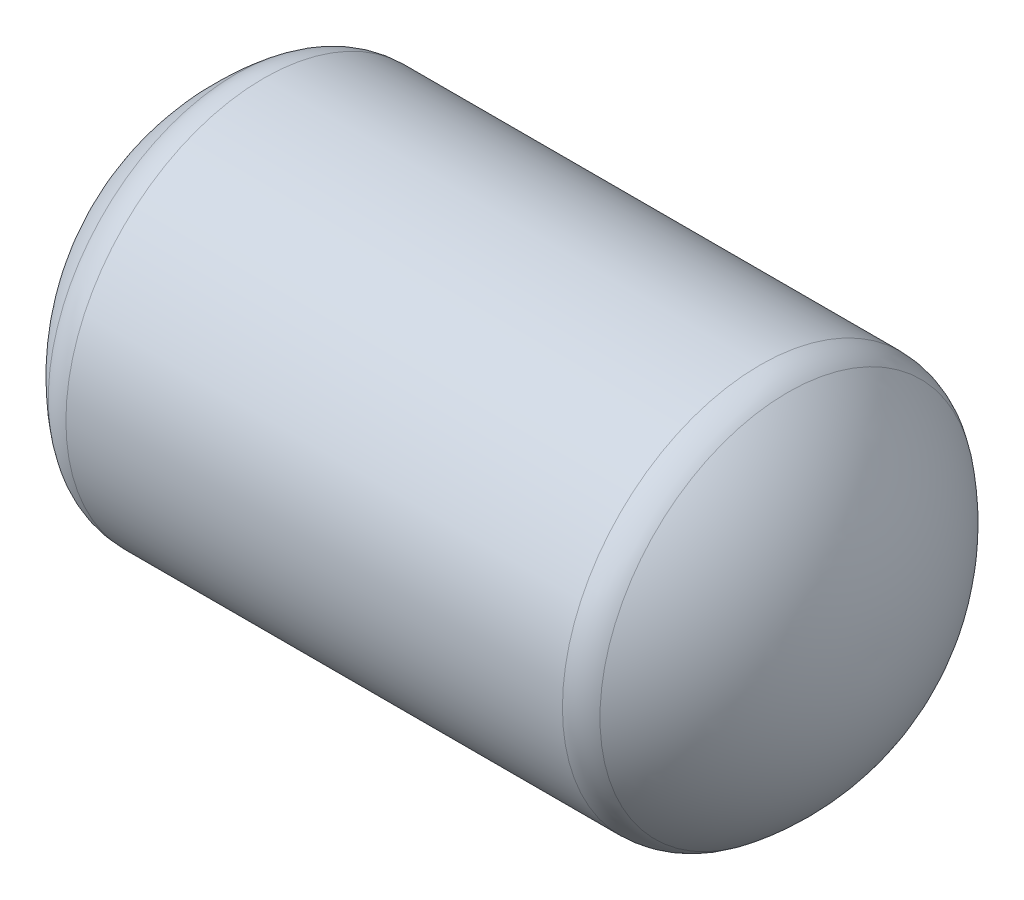
ISO-10303-21;
HEADER;
FILE_DESCRIPTION(('STEP AP214'),'2;1');
FILE_NAME('part.step','',(''),(''),'','','');
FILE_SCHEMA(('AUTOMOTIVE_DESIGN { 1 0 10303 214 1 1 1 1 }'));
ENDSEC;
DATA;
#1=APPLICATION_CONTEXT('core data for automotive mechanical design processes');
#2=APPLICATION_PROTOCOL_DEFINITION('international standard','automotive_design',2000,#1);
#3=PRODUCT_CONTEXT('',#1,'mechanical');
#4=PRODUCT('Part','Part','',(#3));
#5=PRODUCT_RELATED_PRODUCT_CATEGORY('part','',(#4));
#6=PRODUCT_DEFINITION_FORMATION('','',#4);
#7=PRODUCT_DEFINITION_CONTEXT('part definition',#1,'design');
#8=PRODUCT_DEFINITION('design','',#6,#7);
#9=PRODUCT_DEFINITION_SHAPE('','',#8);
#10=(LENGTH_UNIT() NAMED_UNIT(*) SI_UNIT(.MILLI.,.METRE.));
#11=(NAMED_UNIT(*) PLANE_ANGLE_UNIT() SI_UNIT($,.RADIAN.));
#12=(NAMED_UNIT(*) SI_UNIT($,.STERADIAN.) SOLID_ANGLE_UNIT());
#13=UNCERTAINTY_MEASURE_WITH_UNIT(LENGTH_MEASURE(1.E-05),#10,'distance_accuracy_value','');
#14=(GEOMETRIC_REPRESENTATION_CONTEXT(3) GLOBAL_UNCERTAINTY_ASSIGNED_CONTEXT((#13)) GLOBAL_UNIT_ASSIGNED_CONTEXT((#10,
#11,#12)) REPRESENTATION_CONTEXT('',''));
#15=CARTESIAN_POINT('',(0.,0.,0.));
#16=DIRECTION('',(0.,0.,1.));
#17=DIRECTION('',(1.,0.,0.));
#18=AXIS2_PLACEMENT_3D('',#15,#16,#17);
#19=CARTESIAN_POINT('',(-299.86351332894,12.7970846937862,0.));
#20=DIRECTION('',(0.,0.,-1.));
#21=DIRECTION('',(0.,1.,0.));
#22=AXIS2_PLACEMENT_3D('',#19,#20,#21);
#23=CIRCLE('',#22,600.);
#24=TRIMMED_CURVE('',#23,(PARAMETER_VALUE(-1.59212641868309)),
(PARAMETER_VALUE(1.59212641868309)),.T.,.PARAMETER.);
#25=CARTESIAN_POINT('',(-299.86351332894,0.,0.));
#26=DIRECTION('',(1.,0.,0.));
#27=AXIS1_PLACEMENT('',#25,#26);
#28=SURFACE_OF_REVOLUTION('',#24,#27);
#29=CARTESIAN_POINT('',(71.1325985407371,0.,0.));
#30=DIRECTION('',(1.,0.,0.));
#31=DIRECTION('',(0.,1.,0.));
#32=AXIS2_PLACEMENT_3D('',#29,#30,#31);
#33=CIRCLE('',#32,484.349716939204);
#34=CARTESIAN_POINT('',(71.1325985407371,484.349716939204,0.));
#35=VERTEX_POINT('',#34);
#36=EDGE_CURVE('E149',#35,#35,#33,.T.);
#37=ORIENTED_EDGE('',*,*,#36,.T.);
#38=EDGE_LOOP('',(#37));
#39=FACE_BOUND('',#38,.T.);
#40=CARTESIAN_POINT('',(300.,0.,0.));
#41=VERTEX_POINT('',#40);
#42=VERTEX_LOOP('',#41);
#43=FACE_BOUND('',#42,.T.);
#44=ADVANCED_FACE('F53',(#39,#43),#28,.T.);
#45=CARTESIAN_POINT('',(-3.0666238331984,0.,0.));
#46=DIRECTION('',(1.,0.,0.));
#47=DIRECTION('',(0.,1.,0.));
#48=AXIS2_PLACEMENT_3D('',#45,#46,#47);
#49=TOROIDAL_SURFACE('',#48,390.03919049012,120.);
#50=ORIENTED_EDGE('',*,*,#36,.F.);
#51=EDGE_LOOP('',(#50));
#52=FACE_BOUND('',#51,.T.);
#53=CARTESIAN_POINT('',(0.,0.,0.));
#54=DIRECTION('',(1.,0.,0.));
#55=DIRECTION('',(0.,0.,-1.));
#56=AXIS2_PLACEMENT_3D('',#53,#54,#55);
#57=CIRCLE('',#56,510.);
#58=CARTESIAN_POINT('',(0.,0.,-510.));
#59=VERTEX_POINT('',#58);
#60=EDGE_CURVE('E12',#59,#59,#57,.T.);
#61=ORIENTED_EDGE('',*,*,#60,.T.);
#62=EDGE_LOOP('',(#61));
#63=FACE_BOUND('',#62,.T.);
#64=ADVANCED_FACE('F104',(#52,#63),#49,.T.);
#65=CARTESIAN_POINT('',(-640.,0.,0.));
#66=DIRECTION('',(1.,0.,0.));
#67=DIRECTION('',(0.,0.,-1.));
#68=AXIS2_PLACEMENT_3D('',#65,#66,#67);
#69=CYLINDRICAL_SURFACE('',#68,510.);
#70=ORIENTED_EDGE('',*,*,#60,.F.);
#71=EDGE_LOOP('',(#70));
#72=FACE_BOUND('',#71,.T.);
#73=CARTESIAN_POINT('',(-1280.,0.,0.));
#74=DIRECTION('',(1.,0.,0.));
#75=DIRECTION('',(0.,0.,-1.));
#76=AXIS2_PLACEMENT_3D('',#73,#74,#75);
#77=CIRCLE('',#76,510.);
#78=CARTESIAN_POINT('',(-1280.,0.,-510.));
#79=VERTEX_POINT('',#78);
#80=EDGE_CURVE('E134',#79,#79,#77,.T.);
#81=ORIENTED_EDGE('',*,*,#80,.T.);
#82=EDGE_LOOP('',(#81));
#83=FACE_BOUND('',#82,.T.);
#84=ADVANCED_FACE('F55',(#72,#83),#69,.T.);
#85=CARTESIAN_POINT('',(-980.13648667106,12.7970846937862,0.));
#86=DIRECTION('',(0.,0.,1.));
#87=DIRECTION('',(0.,1.,0.));
#88=AXIS2_PLACEMENT_3D('',#85,#86,#87);
#89=CIRCLE('',#88,600.);
#90=TRIMMED_CURVE('',#89,(PARAMETER_VALUE(-1.59212641868309)),
(PARAMETER_VALUE(1.59212641868309)),.T.,.PARAMETER.);
#91=CARTESIAN_POINT('',(-980.13648667106,0.,0.));
#92=DIRECTION('',(-1.,0.,0.));
#93=AXIS1_PLACEMENT('',#91,#92);
#94=SURFACE_OF_REVOLUTION('',#90,#93);
#95=CARTESIAN_POINT('',(-1351.13259854074,0.,0.));
#96=DIRECTION('',(1.,0.,0.));
#97=DIRECTION('',(0.,1.,0.));
#98=AXIS2_PLACEMENT_3D('',#95,#96,#97);
#99=CIRCLE('',#98,484.349716939204);
#100=CARTESIAN_POINT('',(-1351.13259854074,484.349716939204,0.));
#101=VERTEX_POINT('',#100);
#102=EDGE_CURVE('E135',#101,#101,#99,.T.);
#103=ORIENTED_EDGE('',*,*,#102,.F.);
#104=EDGE_LOOP('',(#103));
#105=FACE_BOUND('',#104,.T.);
#106=CARTESIAN_POINT('',(-1580.,0.,0.));
#107=VERTEX_POINT('',#106);
#108=VERTEX_LOOP('',#107);
#109=FACE_BOUND('',#108,.T.);
#110=ADVANCED_FACE('F116',(#105,#109),#94,.T.);
#111=CARTESIAN_POINT('',(-1276.9333761668,0.,0.));
#112=DIRECTION('',(-1.,0.,0.));
#113=DIRECTION('',(0.,1.,0.));
#114=AXIS2_PLACEMENT_3D('',#111,#112,#113);
#115=TOROIDAL_SURFACE('',#114,390.03919049012,120.);
#116=ORIENTED_EDGE('',*,*,#102,.T.);
#117=EDGE_LOOP('',(#116));
#118=FACE_BOUND('',#117,.T.);
#119=ORIENTED_EDGE('',*,*,#80,.F.);
#120=EDGE_LOOP('',(#119));
#121=FACE_BOUND('',#120,.T.);
#122=ADVANCED_FACE('F119',(#118,#121),#115,.T.);
#123=CLOSED_SHELL('',(#44,#64,#84,#110,#122));
#124=CARTESIAN_POINT('',(-640.,0.,0.));
#125=DIRECTION('',(1.,0.,0.));
#126=DIRECTION('',(0.,0.,-1.));
#127=AXIS2_PLACEMENT_3D('',#124,#125,#126);
#128=CYLINDRICAL_SURFACE('',#127,500.);
#129=CARTESIAN_POINT('',(0.,0.,0.));
#130=DIRECTION('',(1.,0.,0.));
#131=DIRECTION('',(0.,0.,-1.));
#132=AXIS2_PLACEMENT_3D('',#129,#130,#131);
#133=CIRCLE('',#132,500.);
#134=CARTESIAN_POINT('',(0.,0.,-500.));
#135=VERTEX_POINT('',#134);
#136=EDGE_CURVE('E62',#135,#135,#133,.T.);
#137=ORIENTED_EDGE('',*,*,#136,.T.);
#138=EDGE_LOOP('',(#137));
#139=FACE_BOUND('',#138,.T.);
#140=CARTESIAN_POINT('',(-1280.,0.,0.));
#141=DIRECTION('',(1.,0.,0.));
#142=DIRECTION('',(0.,0.,-1.));
#143=AXIS2_PLACEMENT_3D('',#140,#141,#142);
#144=CIRCLE('',#143,500.);
#145=CARTESIAN_POINT('',(-1280.,0.,-500.));
#146=VERTEX_POINT('',#145);
#147=EDGE_CURVE('E133',#146,#146,#144,.T.);
#148=ORIENTED_EDGE('',*,*,#147,.F.);
#149=EDGE_LOOP('',(#148));
#150=FACE_BOUND('',#149,.T.);
#151=ADVANCED_FACE('F88',(#139,#150),#128,.F.);
#152=CARTESIAN_POINT('',(0.,0.,0.));
#153=DIRECTION('',(-1.,0.,0.));
#154=DIRECTION('',(0.,-1.,0.));
#155=AXIS2_PLACEMENT_3D('',#152,#153,#154);
#156=PLANE('',#155);
#157=CARTESIAN_POINT('',(0.,0.,0.));
#158=DIRECTION('',(-1.,0.,0.));
#159=DIRECTION('',(0.,-1.,0.));
#160=AXIS2_PLACEMENT_3D('',#157,#158,#159);
#161=CIRCLE('',#160,499.996435900624);
#162=CARTESIAN_POINT('',(0.,-499.996435900624,0.));
#163=VERTEX_POINT('',#162);
#164=EDGE_CURVE('E146',#163,#163,#161,.F.);
#165=ORIENTED_EDGE('',*,*,#164,.T.);
#166=EDGE_LOOP('',(#165));
#167=FACE_BOUND('',#166,.T.);
#168=ORIENTED_EDGE('',*,*,#136,.F.);
#169=EDGE_LOOP('',(#168));
#170=FACE_BOUND('',#169,.T.);
#171=ADVANCED_FACE('F90',(#167,#170),#156,.T.);
#172=CARTESIAN_POINT('',(-3.0666238331984,0.,0.));
#173=DIRECTION('',(1.,0.,0.));
#174=DIRECTION('',(0.,1.,0.));
#175=AXIS2_PLACEMENT_3D('',#172,#173,#174);
#176=TOROIDAL_SURFACE('',#175,390.03919049012,110.);
#177=CARTESIAN_POINT('',(64.9493300095759,0.,0.));
#178=DIRECTION('',(1.,0.,0.));
#179=DIRECTION('',(0.,1.,0.));
#180=AXIS2_PLACEMENT_3D('',#177,#178,#179);
#181=CIRCLE('',#180,476.49050640178);
#182=CARTESIAN_POINT('',(64.9493300095759,476.49050640178,0.));
#183=VERTEX_POINT('',#182);
#184=EDGE_CURVE('E138',#183,#183,#181,.T.);
#185=ORIENTED_EDGE('',*,*,#184,.T.);
#186=EDGE_LOOP('',(#185));
#187=FACE_BOUND('',#186,.T.);
#188=ORIENTED_EDGE('',*,*,#164,.F.);
#189=EDGE_LOOP('',(#188));
#190=FACE_BOUND('',#189,.T.);
#191=ADVANCED_FACE('F96',(#187,#190),#176,.F.);
#192=CARTESIAN_POINT('',(-299.86351332894,12.7970846937862,0.));
#193=DIRECTION('',(0.,0.,-1.));
#194=DIRECTION('',(0.,1.,0.));
#195=AXIS2_PLACEMENT_3D('',#192,#193,#194);
#196=CIRCLE('',#195,590.);
#197=TRIMMED_CURVE('',#196,(PARAMETER_VALUE(-1.59248800190501)),
(PARAMETER_VALUE(1.59248800190501)),.T.,.PARAMETER.);
#198=CARTESIAN_POINT('',(-299.86351332894,0.,0.));
#199=DIRECTION('',(1.,0.,0.));
#200=AXIS1_PLACEMENT('',#198,#199);
#201=SURFACE_OF_REVOLUTION('',#197,#200);
#202=ORIENTED_EDGE('',*,*,#184,.F.);
#203=EDGE_LOOP('',(#202));
#204=FACE_BOUND('',#203,.T.);
#205=CARTESIAN_POINT('',(289.997686126779,0.,0.));
#206=VERTEX_POINT('',#205);
#207=VERTEX_LOOP('',#206);
#208=FACE_BOUND('',#207,.T.);
#209=ADVANCED_FACE('F111',(#204,#208),#201,.F.);
#210=CARTESIAN_POINT('',(-1280.,0.,0.));
#211=DIRECTION('',(1.,0.,0.));
#212=DIRECTION('',(0.,-1.,0.));
#213=AXIS2_PLACEMENT_3D('',#210,#211,#212);
#214=PLANE('',#213);
#215=CARTESIAN_POINT('',(-1280.,0.,0.));
#216=DIRECTION('',(-1.,0.,0.));
#217=DIRECTION('',(0.,-1.,0.));
#218=AXIS2_PLACEMENT_3D('',#215,#216,#217);
#219=CIRCLE('',#218,499.996435900624);
#220=CARTESIAN_POINT('',(-1280.,-499.996435900624,0.));
#221=VERTEX_POINT('',#220);
#222=EDGE_CURVE('E130',#221,#221,#219,.F.);
#223=ORIENTED_EDGE('',*,*,#222,.F.);
#224=EDGE_LOOP('',(#223));
#225=FACE_BOUND('',#224,.T.);
#226=ORIENTED_EDGE('',*,*,#147,.T.);
#227=EDGE_LOOP('',(#226));
#228=FACE_BOUND('',#227,.T.);
#229=ADVANCED_FACE('F84',(#225,#228),#214,.T.);
#230=CARTESIAN_POINT('',(-1276.9333761668,0.,0.));
#231=DIRECTION('',(-1.,0.,0.));
#232=DIRECTION('',(0.,1.,0.));
#233=AXIS2_PLACEMENT_3D('',#230,#231,#232);
#234=TOROIDAL_SURFACE('',#233,390.03919049012,110.);
#235=CARTESIAN_POINT('',(-1344.94933000958,0.,0.));
#236=DIRECTION('',(1.,0.,0.));
#237=DIRECTION('',(0.,1.,0.));
#238=AXIS2_PLACEMENT_3D('',#235,#236,#237);
#239=CIRCLE('',#238,476.49050640178);
#240=CARTESIAN_POINT('',(-1344.94933000958,476.49050640178,0.));
#241=VERTEX_POINT('',#240);
#242=EDGE_CURVE('E261',#241,#241,#239,.T.);
#243=ORIENTED_EDGE('',*,*,#242,.F.);
#244=EDGE_LOOP('',(#243));
#245=FACE_BOUND('',#244,.T.);
#246=ORIENTED_EDGE('',*,*,#222,.T.);
#247=EDGE_LOOP('',(#246));
#248=FACE_BOUND('',#247,.T.);
#249=ADVANCED_FACE('F77',(#245,#248),#234,.F.);
#250=CARTESIAN_POINT('',(-980.13648667106,12.7970846937862,0.));
#251=DIRECTION('',(0.,0.,1.));
#252=DIRECTION('',(0.,1.,0.));
#253=AXIS2_PLACEMENT_3D('',#250,#251,#252);
#254=CIRCLE('',#253,590.);
#255=TRIMMED_CURVE('',#254,(PARAMETER_VALUE(-1.59248800190501)),
(PARAMETER_VALUE(1.59248800190501)),.T.,.PARAMETER.);
#256=CARTESIAN_POINT('',(-980.13648667106,0.,0.));
#257=DIRECTION('',(-1.,0.,0.));
#258=AXIS1_PLACEMENT('',#256,#257);
#259=SURFACE_OF_REVOLUTION('',#255,#258);
#260=ORIENTED_EDGE('',*,*,#242,.T.);
#261=EDGE_LOOP('',(#260));
#262=FACE_BOUND('',#261,.T.);
#263=CARTESIAN_POINT('',(-1569.99768612678,0.,0.));
#264=VERTEX_POINT('',#263);
#265=VERTEX_LOOP('',#264);
#266=FACE_BOUND('',#265,.T.);
#267=ADVANCED_FACE('F75',(#262,#266),#259,.F.);
#268=CLOSED_SHELL('',(#151,#171,#191,#209,#229,#249,#267));
#269=ORIENTED_CLOSED_SHELL('',*,#268,.T.);
#270=BREP_WITH_VOIDS('B2',#123,(#269));
#271=ADVANCED_BREP_SHAPE_REPRESENTATION('',(#18,#270),#14);
#272=SHAPE_DEFINITION_REPRESENTATION(#9,#271);
ENDSEC;
END-ISO-10303-21;
